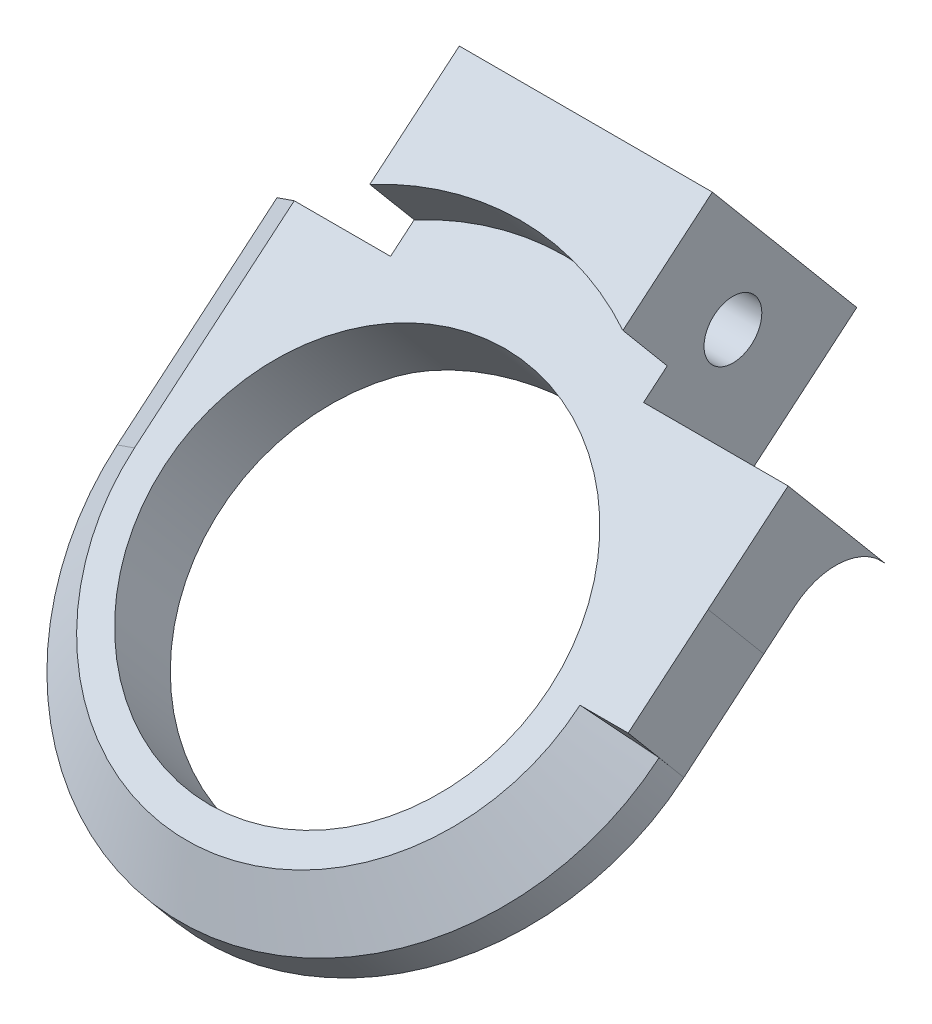
ISO-10303-21;
HEADER;
FILE_DESCRIPTION(('STEP AP214'),'2;1');
FILE_NAME('part.step','',(''),(''),'','','');
FILE_SCHEMA(('AUTOMOTIVE_DESIGN { 1 0 10303 214 1 1 1 1 }'));
ENDSEC;
DATA;
#1=APPLICATION_CONTEXT('core data for automotive mechanical design processes');
#2=APPLICATION_PROTOCOL_DEFINITION('international standard','automotive_design',2000,#1);
#3=PRODUCT_CONTEXT('',#1,'mechanical');
#4=PRODUCT('Part','Part','',(#3));
#5=PRODUCT_RELATED_PRODUCT_CATEGORY('part','',(#4));
#6=PRODUCT_DEFINITION_FORMATION('','',#4);
#7=PRODUCT_DEFINITION_CONTEXT('part definition',#1,'design');
#8=PRODUCT_DEFINITION('design','',#6,#7);
#9=PRODUCT_DEFINITION_SHAPE('','',#8);
#10=(LENGTH_UNIT() NAMED_UNIT(*) SI_UNIT(.MILLI.,.METRE.));
#11=(NAMED_UNIT(*) PLANE_ANGLE_UNIT() SI_UNIT($,.RADIAN.));
#12=(NAMED_UNIT(*) SI_UNIT($,.STERADIAN.) SOLID_ANGLE_UNIT());
#13=UNCERTAINTY_MEASURE_WITH_UNIT(LENGTH_MEASURE(1.E-05),#10,'distance_accuracy_value','');
#14=(GEOMETRIC_REPRESENTATION_CONTEXT(3) GLOBAL_UNCERTAINTY_ASSIGNED_CONTEXT((#13)) GLOBAL_UNIT_ASSIGNED_CONTEXT((#10,
#11,#12)) REPRESENTATION_CONTEXT('',''));
#15=CARTESIAN_POINT('',(0.,0.,0.));
#16=DIRECTION('',(0.,0.,1.));
#17=DIRECTION('',(1.,0.,0.));
#18=AXIS2_PLACEMENT_3D('',#15,#16,#17);
#19=CARTESIAN_POINT('',(-5.50115242270663,-19.2881865771624,11.9339053515406));
#20=DIRECTION('',(0.,-0.766044443118976,-0.642787609686541));
#21=DIRECTION('',(0.,0.642787609686541,-0.766044443118977));
#22=AXIS2_PLACEMENT_3D('',#19,#20,#21);
#23=CYLINDRICAL_SURFACE('',#22,8.43884757729339);
#24=DIRECTION('',(0.,-0.766044443118976,-0.642787609686541));
#25=VECTOR('',#24,1.);
#26=CARTESIAN_POINT('',(2.93769515458676,-19.2881865771624,11.9339053515406));
#27=LINE('',#26,#25);
#28=CARTESIAN_POINT('',(2.93769515458676,-20.4372532418409,10.9697239370108));
#29=VERTEX_POINT('',#28);
#30=CARTESIAN_POINT('',(2.93769515458676,-21.3565065735837,10.1983788053869));
#31=VERTEX_POINT('',#30);
#32=EDGE_CURVE('E339',#29,#31,#27,.T.);
#33=ORIENTED_EDGE('',*,*,#32,.F.);
#34=CARTESIAN_POINT('',(-5.50115242270663,-20.4372532418409,10.9697239370108));
#35=DIRECTION('',(0.,-0.766044443118977,-0.642787609686541));
#36=DIRECTION('',(0.,0.642787609686541,-0.766044443118976));
#37=AXIS2_PLACEMENT_3D('',#34,#35,#36);
#38=CIRCLE('',#37,8.43884757729339);
#39=CARTESIAN_POINT('',(-13.94,-20.4372532418409,10.9697239370108));
#40=VERTEX_POINT('',#39);
#41=EDGE_CURVE('E124',#29,#40,#38,.T.);
#42=ORIENTED_EDGE('',*,*,#41,.T.);
#43=DIRECTION('',(0.,-0.766044443118976,-0.642787609686541));
#44=VECTOR('',#43,1.);
#45=CARTESIAN_POINT('',(-13.94,-19.2881865771624,11.9339053515406));
#46=LINE('',#45,#44);
#47=CARTESIAN_POINT('',(-13.94,-21.3565065735837,10.1983788053869));
#48=VERTEX_POINT('',#47);
#49=EDGE_CURVE('E336',#40,#48,#46,.T.);
#50=ORIENTED_EDGE('',*,*,#49,.T.);
#51=CARTESIAN_POINT('',(-5.50115242270663,-21.3565065735837,10.1983788053869));
#52=DIRECTION('',(0.,-0.766044443118977,-0.642787609686541));
#53=DIRECTION('',(0.,0.642787609686541,-0.766044443118977));
#54=AXIS2_PLACEMENT_3D('',#51,#52,#53);
#55=CIRCLE('',#54,8.43884757729339);
#56=EDGE_CURVE('E327',#31,#48,#55,.T.);
#57=ORIENTED_EDGE('',*,*,#56,.F.);
#58=EDGE_LOOP('',(#33,#42,#50,#57));
#59=FACE_BOUND('',#58,.T.);
#60=ADVANCED_FACE('F113',(#59),#23,.T.);
#61=CARTESIAN_POINT('',(-13.9443048454133,-13.8457153207248,16.5006809755104));
#62=DIRECTION('',(0.,-0.642787609686541,0.766044443118976));
#63=DIRECTION('',(0.,-0.766044443118977,-0.642787609686541));
#64=AXIS2_PLACEMENT_3D('',#61,#62,#63);
#65=PLANE('',#64);
#66=DIRECTION('',(1.,0.,0.));
#67=VECTOR('',#66,1.);
#68=CARTESIAN_POINT('',(-13.9443048454133,-19.2881865771624,11.9339053515406));
#69=LINE('',#68,#67);
#70=CARTESIAN_POINT('',(1.43769515458674,-19.2881865771624,11.9339053515406));
#71=VERTEX_POINT('',#70);
#72=CARTESIAN_POINT('',(2.94,-19.2881865771624,11.9339053515406));
#73=VERTEX_POINT('',#72);
#74=EDGE_CURVE('E290',#71,#73,#69,.T.);
#75=ORIENTED_EDGE('',*,*,#74,.F.);
#76=DIRECTION('',(-0.707106781186548,0.5416752204197,0.454519477672045));
#77=VECTOR('',#76,1.);
#78=CARTESIAN_POINT('',(-5.50115242270663,-13.9727209489273,16.3941105997282));
#79=LINE('',#78,#77);
#80=EDGE_CURVE('E13',#71,#29,#79,.F.);
#81=ORIENTED_EDGE('',*,*,#80,.T.);
#82=ORIENTED_EDGE('',*,*,#32,.T.);
#83=DIRECTION('',(1.,0.,0.));
#84=VECTOR('',#83,1.);
#85=CARTESIAN_POINT('',(-13.9443048454133,-21.3565065735837,10.1983788053869));
#86=LINE('',#85,#84);
#87=CARTESIAN_POINT('',(2.94,-21.3565065735837,10.1983788053869));
#88=VERTEX_POINT('',#87);
#89=EDGE_CURVE('E296',#31,#88,#86,.T.);
#90=ORIENTED_EDGE('',*,*,#89,.T.);
#91=DIRECTION('',(0.,-0.766044443118977,-0.642787609686541));
#92=VECTOR('',#91,1.);
#93=CARTESIAN_POINT('',(2.94,-13.8457153207248,16.5006809755104));
#94=LINE('',#93,#92);
#95=EDGE_CURVE('E295',#73,#88,#94,.T.);
#96=ORIENTED_EDGE('',*,*,#95,.F.);
#97=EDGE_LOOP('',(#75,#81,#82,#90,#96));
#98=FACE_BOUND('',#97,.T.);
#99=ADVANCED_FACE('F397',(#98),#65,.T.);
#100=CARTESIAN_POINT('',(2.94,0.,0.));
#101=DIRECTION('',(1.,0.,0.));
#102=DIRECTION('',(0.,1.,0.));
#103=AXIS2_PLACEMENT_3D('',#100,#101,#102);
#104=PLANE('',#103);
#105=DIRECTION('',(0.,0.642787609686541,-0.766044443118976));
#106=VECTOR('',#105,1.);
#107=CARTESIAN_POINT('',(2.94,-7.51079125285886,-6.30230217012344));
#108=LINE('',#107,#106);
#109=CARTESIAN_POINT('',(2.94,-19.267446842078,7.70873436522123));
#110=VERTEX_POINT('',#109);
#111=EDGE_CURVE('E291',#88,#110,#108,.T.);
#112=ORIENTED_EDGE('',*,*,#111,.T.);
#113=DIRECTION('',(0.,0.766044443118874,0.642787609686663));
#114=VECTOR('',#113,1.);
#115=CARTESIAN_POINT('',(2.94,-11.7566555892223,14.0110365353439));
#116=LINE('',#115,#114);
#117=CARTESIAN_POINT('',(2.94,-17.1991268456568,9.44426091137489));
#118=VERTEX_POINT('',#117);
#119=EDGE_CURVE('E286',#110,#118,#116,.T.);
#120=ORIENTED_EDGE('',*,*,#119,.T.);
#121=DIRECTION('',(0.,-0.642787609686541,0.766044443118976));
#122=VECTOR('',#121,1.);
#123=CARTESIAN_POINT('',(2.94,-5.44247125643762,-4.56677562396978));
#124=LINE('',#123,#122);
#125=EDGE_CURVE('E300',#118,#73,#124,.T.);
#126=ORIENTED_EDGE('',*,*,#125,.T.);
#127=ORIENTED_EDGE('',*,*,#95,.T.);
#128=EDGE_LOOP('',(#112,#120,#126,#127));
#129=FACE_BOUND('',#128,.T.);
#130=ADVANCED_FACE('F400',(#129),#104,.T.);
#131=CARTESIAN_POINT('',(2.95296955309349,-5.44381737994169,-4.56517137644774));
#132=DIRECTION('',(-0.999999748529686,0.000455854061936737,-0.000543265716011508));
#133=DIRECTION('',(-0.000543265772457619,0.,0.999999852431139));
#134=AXIS2_PLACEMENT_3D('',#131,#132,#133);
#135=PLANE('',#134);
#136=DIRECTION('',(0.000709183025725883,0.642787448044539,-0.76604425048154));
#137=VECTOR('',#136,1.);
#138=CARTESIAN_POINT('',(2.95296955309349,-5.44381737994169,-4.56517137644774));
#139=LINE('',#138,#137);
#140=CARTESIAN_POINT('',(2.94230484541318,-15.1100671141999,6.95461647126721));
#141=VERTEX_POINT('',#140);
#142=EDGE_CURVE('E317',#118,#141,#139,.T.);
#143=ORIENTED_EDGE('',*,*,#142,.F.);
#144=ORIENTED_EDGE('',*,*,#119,.F.);
#145=DIRECTION('',(0.000709183025725883,0.642787448044539,-0.76604425048154));
#146=VECTOR('',#145,1.);
#147=CARTESIAN_POINT('',(2.95296955309348,-7.51213737636293,-6.3006979226014));
#148=LINE('',#147,#146);
#149=CARTESIAN_POINT('',(2.94088647900505,-18.4639623299942,6.7511788113515));
#150=VERTEX_POINT('',#149);
#151=EDGE_CURVE('E323',#110,#150,#148,.T.);
#152=ORIENTED_EDGE('',*,*,#151,.T.);
#153=CARTESIAN_POINT('',(2.94088647900505,-19.9960512162321,5.46560359197841));
#154=DIRECTION('',(-0.999999748529686,0.000455854061936737,-0.000543265716011508));
#155=DIRECTION('',(0.000709183025725883,0.642787448044569,-0.766044250481515));
#156=AXIS2_PLACEMENT_3D('',#153,#154,#155);
#157=ELLIPSE('',#156,2.00000050294075,2.);
#158=CARTESIAN_POINT('',(2.94230484541318,-18.7104742686853,3.93351615585046));
#159=VERTEX_POINT('',#158);
#160=EDGE_CURVE('E436',#150,#159,#157,.T.);
#161=ORIENTED_EDGE('',*,*,#160,.T.);
#162=DIRECTION('',(0.,-0.766044443118976,-0.642787609686541));
#163=VECTOR('',#162,1.);
#164=CARTESIAN_POINT('',(2.94230484541318,-15.1100671141999,6.95461647126721));
#165=LINE('',#164,#163);
#166=EDGE_CURVE('E319',#141,#159,#165,.T.);
#167=ORIENTED_EDGE('',*,*,#166,.F.);
#168=EDGE_LOOP('',(#143,#144,#152,#161,#167));
#169=FACE_BOUND('',#168,.T.);
#170=ADVANCED_FACE('F403',(#169),#135,.F.);
#171=CARTESIAN_POINT('',(-5.50115242270663,-19.2881865771624,11.9339053515406));
#172=DIRECTION('',(0.,-0.766044443118976,-0.642787609686541));
#173=DIRECTION('',(0.,0.642787609686541,-0.766044443118977));
#174=AXIS2_PLACEMENT_3D('',#171,#172,#173);
#175=CYLINDRICAL_SURFACE('',#174,6.);
#176=CARTESIAN_POINT('',(-5.50115242270663,-19.2881865771624,11.9339053515406));
#177=DIRECTION('',(0.,-0.766044443118977,-0.642787609686541));
#178=DIRECTION('',(0.,0.642787609686541,-0.766044443118977));
#179=AXIS2_PLACEMENT_3D('',#176,#177,#178);
#180=CIRCLE('',#179,6.);
#181=CARTESIAN_POINT('',(-5.50115242270663,-15.4314609190432,7.33763869282674));
#182=VERTEX_POINT('',#181);
#183=EDGE_CURVE('E309',#182,#182,#180,.T.);
#184=ORIENTED_EDGE('',*,*,#183,.F.);
#185=EDGE_LOOP('',(#184));
#186=FACE_BOUND('',#185,.T.);
#187=CARTESIAN_POINT('',(-5.50115242270663,-21.3565065735837,10.1983788053869));
#188=DIRECTION('',(0.,-0.766044443118977,-0.642787609686541));
#189=DIRECTION('',(0.,0.642787609686541,-0.766044443118977));
#190=AXIS2_PLACEMENT_3D('',#187,#188,#189);
#191=CIRCLE('',#190,6.);
#192=CARTESIAN_POINT('',(-1.53252545610982,-18.4639623299942,6.75117881135149));
#193=VERTEX_POINT('',#192);
#194=CARTESIAN_POINT('',(-9.46977938930343,-18.4639623299942,6.75117881135149));
#195=VERTEX_POINT('',#194);
#196=EDGE_CURVE('E304',#193,#195,#191,.T.);
#197=ORIENTED_EDGE('',*,*,#196,.T.);
#198=CARTESIAN_POINT('',(-9.46977938930343,-18.4639623299942,6.75117881135149));
#199=CARTESIAN_POINT('',(-9.37862169468854,-18.4122980321714,6.68955321661601));
#200=CARTESIAN_POINT('',(-9.28509953104678,-18.3661466106757,6.62706909844798));
#201=CARTESIAN_POINT('',(-9.09416672156057,-18.283826019583,6.50190247073366));
#202=CARTESIAN_POINT('',(-8.99676425993292,-18.2476369938758,6.43922061139788));
#203=CARTESIAN_POINT('',(-8.79876985312388,-18.1840730814926,6.31506263327178));
#204=CARTESIAN_POINT('',(-8.69818582699753,-18.1566779522092,6.25358405574983));
#205=CARTESIAN_POINT('',(-8.49397943520097,-18.1094655647828,6.13269363169669));
#206=CARTESIAN_POINT('',(-8.39035522162075,-18.0896530227762,6.07328309223355));
#207=CARTESIAN_POINT('',(-8.13368430218231,-18.0491805338425,5.93171886702356));
#208=CARTESIAN_POINT('',(-7.97916556496682,-18.0320671812606,5.85120981137211));
#209=CARTESIAN_POINT('',(-7.66495794070854,-18.0082430426636,5.69914060067199));
#210=CARTESIAN_POINT('',(-7.5052665709667,-18.0015373298356,5.62758482549946));
#211=CARTESIAN_POINT('',(-7.18108293056653,-17.9952123977869,5.49638329640465));
#212=CARTESIAN_POINT('',(-7.01659534371404,-17.9955864817933,5.43672634138484));
#213=CARTESIAN_POINT('',(-6.68291332584876,-17.9997874233723,5.33273705149118));
#214=CARTESIAN_POINT('',(-6.51372272179532,-18.003611548921,5.28839262932088));
#215=CARTESIAN_POINT('',(-6.2229202094354,-18.0099041275027,5.22934522650318));
#216=CARTESIAN_POINT('',(-6.10230761649468,-18.0124343136945,5.20973827466109));
#217=CARTESIAN_POINT('',(-5.85982011443931,-18.0163410706682,5.18106285275405));
#218=CARTESIAN_POINT('',(-5.73794559862681,-18.0177179905451,5.17199119332329));
#219=CARTESIAN_POINT('',(-5.4941712724623,-18.0187631380412,5.16502739148684));
#220=CARTESIAN_POINT('',(-5.37227230410129,-18.0184356742397,5.16710705959902));
#221=CARTESIAN_POINT('',(-5.12916532922561,-18.0162153236688,5.18222544631032));
#222=CARTESIAN_POINT('',(-5.00795747769241,-18.0143220986858,5.19526653265087));
#223=CARTESIAN_POINT('',(-4.73628787660028,-18.0091328277104,5.23608180582959));
#224=CARTESIAN_POINT('',(-4.58627139066659,-18.005601855995,5.26677073907089));
#225=CARTESIAN_POINT('',(-4.28958537431741,-17.999552060821,5.34157190222072));
#226=CARTESIAN_POINT('',(-4.14291811550882,-17.9970339061351,5.38569296782694));
#227=CARTESIAN_POINT('',(-3.85218606796885,-17.9955237993675,5.48516429859632));
#228=CARTESIAN_POINT('',(-3.70815027659727,-17.9965593405046,5.54059898115322));
#229=CARTESIAN_POINT('',(-3.42397785310256,-18.0046393537908,5.66021412265168));
#230=CARTESIAN_POINT('',(-3.28384041740168,-18.0116825779404,5.7243927628503));
#231=CARTESIAN_POINT('',(-3.00118372744777,-18.0345576296606,5.86269670713215));
#232=CARTESIAN_POINT('',(-2.85885255966114,-18.0507796951208,5.93714418487629));
#233=CARTESIAN_POINT('',(-2.57889169389656,-18.0948075401798,6.09147852925638));
#234=CARTESIAN_POINT('',(-2.44126382668022,-18.1226177761389,6.17136747857317));
#235=CARTESIAN_POINT('',(-2.17294570267754,-18.1920256799879,6.33346492858196));
#236=CARTESIAN_POINT('',(-2.04219720263159,-18.2334734729486,6.41563969714904));
#237=CARTESIAN_POINT('',(-1.78742207734757,-18.3327328685745,6.58032799906759));
#238=CARTESIAN_POINT('',(-1.66338739552647,-18.3905243158119,6.66284099255785));
#239=CARTESIAN_POINT('',(-1.43023029967731,-18.5213118071472,6.82022741030451));
#240=CARTESIAN_POINT('',(-1.32066219014979,-18.5932836423387,6.89527050451693));
#241=CARTESIAN_POINT('',(-1.16284429055658,-18.7155390999362,7.0029000143598));
#242=CARTESIAN_POINT('',(-1.11105055831094,-18.7589637747549,7.03814090923168));
#243=CARTESIAN_POINT('',(-1.01010230325754,-18.8507106188197,7.1061701702599));
#244=CARTESIAN_POINT('',(-0.96095177029142,-18.8990398906119,7.13895485661951));
#245=CARTESIAN_POINT('',(-0.913300712983845,-18.9498484746997,7.1701445341708));
#246=B_SPLINE_CURVE_WITH_KNOTS('',3,(#198,#199,#200,#201,#202,#203,#204,#205,#206,#207,#208,
#209,#210,#211,#212,#213,#214,#215,#216,#217,#218,#219,#220,#221,#222,#223,#224,#225,#226,#227,
#228,#229,#230,#231,#232,#233,#234,#235,#236,#237,#238,#239,#240,#241,#242,#243,#244,#245),
.UNSPECIFIED.,.F.,.F.,(4,2,2,2,2,2,2,2,2,2,2,2,2,2,2,2,2,2,2,2,2,2,2,4),(0.,0.364334039627484,
0.727936577060484,1.09069603649164,1.45368075591004,1.97820039848978,2.50297563711395,
3.02725451618555,3.55111859262062,3.91738007298245,4.28353064549791,4.64875606168347,
5.01406038934136,5.47277988801226,5.9318017881586,6.39438289789354,6.85686793724611,
7.34067646906679,7.82467122681737,8.30351532887487,8.78177146368479,9.2334325964669,
9.46188901720993,9.6906811283447),.UNSPECIFIED.);
#247=EDGE_CURVE('E518',#195,#193,#246,.T.);
#248=ORIENTED_EDGE('',*,*,#247,.T.);
#249=EDGE_LOOP('',(#197,#248));
#250=FACE_BOUND('',#249,.T.);
#251=ADVANCED_FACE('F386',(#186,#250),#175,.F.);
#252=CARTESIAN_POINT('',(6.34145450061764,-9.15778680556446,-7.68429553094933));
#253=DIRECTION('',(0.,-0.766044443118977,-0.642787609686541));
#254=DIRECTION('',(0.,0.642787609686541,-0.766044443118977));
#255=AXIS2_PLACEMENT_3D('',#252,#253,#254);
#256=PLANE('',#255);
#257=DIRECTION('',(0.,-0.642787609686541,0.766044443118977));
#258=VECTOR('',#257,1.);
#259=CARTESIAN_POINT('',(-9.44230484541406,-9.15778680556462,-7.68429553094947));
#260=LINE('',#259,#258);
#261=CARTESIAN_POINT('',(-9.44230484541406,-15.8685596587687,0.313292125940205));
#262=VERTEX_POINT('',#261);
#263=CARTESIAN_POINT('',(-9.44230484541406,-18.8253826633269,3.8370965642875));
#264=VERTEX_POINT('',#263);
#265=EDGE_CURVE('E473',#262,#264,#260,.T.);
#266=ORIENTED_EDGE('',*,*,#265,.F.);
#267=DIRECTION('',(-1.,0.,0.));
#268=VECTOR('',#267,1.);
#269=CARTESIAN_POINT('',(6.34145450061764,-15.8685596587686,0.313292125940343));
#270=LINE('',#269,#268);
#271=CARTESIAN_POINT('',(-1.55999999999991,-15.8685596587686,0.313292125940294));
#272=VERTEX_POINT('',#271);
#273=EDGE_CURVE('E254',#272,#262,#270,.T.);
#274=ORIENTED_EDGE('',*,*,#273,.F.);
#275=DIRECTION('',(0.,0.642787609686541,-0.766044443118977));
#276=VECTOR('',#275,1.);
#277=CARTESIAN_POINT('',(-1.55999999999991,-9.15778680556454,-7.6842955309494));
#278=LINE('',#277,#276);
#279=CARTESIAN_POINT('',(-1.5599999999999,-18.8253826633268,3.83709656428759));
#280=VERTEX_POINT('',#279);
#281=EDGE_CURVE('E256',#280,#272,#278,.T.);
#282=ORIENTED_EDGE('',*,*,#281,.F.);
#283=DIRECTION('',(1.,0.,0.));
#284=VECTOR('',#283,1.);
#285=CARTESIAN_POINT('',(2.51804077670073,-18.8253826633267,3.83709656428762));
#286=LINE('',#285,#284);
#287=EDGE_CURVE('E268',#264,#280,#286,.T.);
#288=ORIENTED_EDGE('',*,*,#287,.F.);
#289=EDGE_LOOP('',(#266,#274,#282,#288));
#290=FACE_BOUND('',#289,.T.);
#291=ADVANCED_FACE('F380',(#290),#256,.T.);
#292=CARTESIAN_POINT('',(6.34145450061755,-3.79547570373163,-3.18478226314355));
#293=DIRECTION('',(0.,0.766044443118977,0.642787609686541));
#294=DIRECTION('',(0.,-0.642787609686541,0.766044443118977));
#295=AXIS2_PLACEMENT_3D('',#292,#293,#294);
#296=PLANE('',#295);
#297=DIRECTION('',(0.,0.642787609686541,-0.766044443118977));
#298=VECTOR('',#297,1.);
#299=CARTESIAN_POINT('',(-9.44230484541415,-3.79547570373179,-3.18478226314369));
#300=LINE('',#299,#298);
#301=CARTESIAN_POINT('',(-9.44230484541415,-12.8447089328262,7.59967394785243));
#302=VERTEX_POINT('',#301);
#303=CARTESIAN_POINT('',(-9.44230484541415,-10.5062485569359,4.81280539374598));
#304=VERTEX_POINT('',#303);
#305=EDGE_CURVE('E231',#302,#304,#300,.T.);
#306=ORIENTED_EDGE('',*,*,#305,.F.);
#307=CARTESIAN_POINT('',(-5.50115242270663,-17.6411910244565,13.3158987123667));
#308=DIRECTION('',(0.,0.766044443118977,0.642787609686541));
#309=DIRECTION('',(0.,-0.642787609686541,0.766044443118977));
#310=AXIS2_PLACEMENT_3D('',#307,#308,#309);
#311=CIRCLE('',#310,8.43884757729339);
#312=CARTESIAN_POINT('',(-1.56,-12.8447089328258,7.59967394785214));
#313=VERTEX_POINT('',#312);
#314=EDGE_CURVE('E263',#313,#302,#311,.T.);
#315=ORIENTED_EDGE('',*,*,#314,.F.);
#316=DIRECTION('',(0.,-0.64278760968654,0.766044443118977));
#317=VECTOR('',#316,1.);
#318=CARTESIAN_POINT('',(-1.56,-10.5062485569358,4.81280539374605));
#319=LINE('',#318,#317);
#320=CARTESIAN_POINT('',(-1.56,-10.5062485569358,4.81280539374605));
#321=VERTEX_POINT('',#320);
#322=EDGE_CURVE('E261',#321,#313,#319,.T.);
#323=ORIENTED_EDGE('',*,*,#322,.F.);
#324=DIRECTION('',(-1.,0.,0.));
#325=VECTOR('',#324,1.);
#326=CARTESIAN_POINT('',(6.34145450061755,-10.5062485569357,4.81280539374612));
#327=LINE('',#326,#325);
#328=EDGE_CURVE('E252',#321,#304,#327,.T.);
#329=ORIENTED_EDGE('',*,*,#328,.T.);
#330=EDGE_LOOP('',(#306,#315,#323,#329));
#331=FACE_BOUND('',#330,.T.);
#332=ADVANCED_FACE('F260',(#331),#296,.T.);
#333=CARTESIAN_POINT('',(6.34145450061748,-6.71077285320405,7.99758765688973));
#334=DIRECTION('',(0.,0.642787609686541,-0.766044443118977));
#335=DIRECTION('',(0.,0.766044443118977,0.642787609686541));
#336=AXIS2_PLACEMENT_3D('',#333,#334,#335);
#337=PLANE('',#336);
#338=DIRECTION('',(0.,0.766044443118977,0.642787609686541));
#339=VECTOR('',#338,1.);
#340=CARTESIAN_POINT('',(-9.44230484541395,-22.2721798674512,-5.0599832293646));
#341=LINE('',#340,#339);
#342=EDGE_CURVE('E235',#262,#304,#341,.T.);
#343=ORIENTED_EDGE('',*,*,#342,.T.);
#344=ORIENTED_EDGE('',*,*,#328,.F.);
#345=DIRECTION('',(0.,0.766044443118977,0.642787609686541));
#346=VECTOR('',#345,1.);
#347=CARTESIAN_POINT('',(-1.55999999999979,-22.2721798674511,-5.05998322936453));
#348=LINE('',#347,#346);
#349=EDGE_CURVE('E491',#272,#321,#348,.T.);
#350=ORIENTED_EDGE('',*,*,#349,.F.);
#351=ORIENTED_EDGE('',*,*,#273,.T.);
#352=EDGE_LOOP('',(#343,#344,#350,#351));
#353=FACE_BOUND('',#352,.T.);
#354=ADVANCED_FACE('F250',(#353),#337,.T.);
#355=CARTESIAN_POINT('',(0.,-5.44247125643763,-4.56677562396978));
#356=DIRECTION('',(0.,-0.766044443118977,-0.642787609686541));
#357=DIRECTION('',(0.,0.642787609686541,-0.766044443118977));
#358=AXIS2_PLACEMENT_3D('',#355,#356,#357);
#359=PLANE('',#358);
#360=ORIENTED_EDGE('',*,*,#183,.T.);
#361=EDGE_LOOP('',(#360));
#362=FACE_BOUND('',#361,.T.);
#363=DIRECTION('',(1.,0.,0.));
#364=VECTOR('',#363,1.);
#365=CARTESIAN_POINT('',(0.,-15.1100671141999,6.95461647126719));
#366=LINE('',#365,#364);
#367=CARTESIAN_POINT('',(-12.4423047511118,-15.1100671141999,6.9546164712672));
#368=VERTEX_POINT('',#367);
#369=CARTESIAN_POINT('',(-9.44230484541412,-15.1100671141999,6.9546164712672));
#370=VERTEX_POINT('',#369);
#371=EDGE_CURVE('E283',#368,#370,#366,.T.);
#372=ORIENTED_EDGE('',*,*,#371,.F.);
#373=DIRECTION('',(0.000354591579746087,-0.642787569276029,0.766044394959604));
#374=VECTOR('',#373,1.);
#375=CARTESIAN_POINT('',(-12.4400000943014,-19.2878446865515,11.9334979021767));
#376=LINE('',#375,#374);
#377=CARTESIAN_POINT('',(-12.4399999796145,-19.2878446865571,11.9334979021835));
#378=VERTEX_POINT('',#377);
#379=EDGE_CURVE('E137',#368,#378,#376,.T.);
#380=ORIENTED_EDGE('',*,*,#379,.T.);
#381=CARTESIAN_POINT('',(-5.50115242270663,-19.2881865771624,11.9339053515406));
#382=DIRECTION('',(0.,-0.766044443118977,-0.642787609686541));
#383=DIRECTION('',(0.,0.642787609686541,-0.766044443118977));
#384=AXIS2_PLACEMENT_3D('',#381,#382,#383);
#385=CIRCLE('',#384,6.93884757729337);
#386=EDGE_CURVE('E448',#378,#71,#385,.F.);
#387=ORIENTED_EDGE('',*,*,#386,.T.);
#388=ORIENTED_EDGE('',*,*,#74,.T.);
#389=ORIENTED_EDGE('',*,*,#125,.F.);
#390=ORIENTED_EDGE('',*,*,#142,.T.);
#391=DIRECTION('',(-1.,0.,0.));
#392=VECTOR('',#391,1.);
#393=CARTESIAN_POINT('',(0.,-15.1100671141999,6.95461647126721));
#394=LINE('',#393,#392);
#395=CARTESIAN_POINT('',(-1.55999999999997,-15.1100671141999,6.95461647126721));
#396=VERTEX_POINT('',#395);
#397=EDGE_CURVE('E313',#141,#396,#394,.T.);
#398=ORIENTED_EDGE('',*,*,#397,.T.);
#399=DIRECTION('',(0.,0.642787609686541,-0.766044443118977));
#400=VECTOR('',#399,1.);
#401=CARTESIAN_POINT('',(-1.55999999999997,-5.44247125643763,-4.56677562396978));
#402=LINE('',#401,#400);
#403=CARTESIAN_POINT('',(-1.55999999999997,-14.4917044855318,6.21768058702598));
#404=VERTEX_POINT('',#403);
#405=EDGE_CURVE('E486',#396,#404,#402,.T.);
#406=ORIENTED_EDGE('',*,*,#405,.T.);
#407=CARTESIAN_POINT('',(-5.50115242270663,-19.2881865771624,11.9339053515406));
#408=DIRECTION('',(0.,0.766044443118977,0.642787609686541));
#409=DIRECTION('',(0.,-0.642787609686541,0.766044443118977));
#410=AXIS2_PLACEMENT_3D('',#407,#408,#409);
#411=CIRCLE('',#410,8.43884757729339);
#412=CARTESIAN_POINT('',(-9.44230484541412,-14.491704485532,6.21768058702632));
#413=VERTEX_POINT('',#412);
#414=EDGE_CURVE('E279',#404,#413,#411,.T.);
#415=ORIENTED_EDGE('',*,*,#414,.T.);
#416=DIRECTION('',(0.,-0.642787609686541,0.766044443118977));
#417=VECTOR('',#416,1.);
#418=CARTESIAN_POINT('',(-9.44230484541412,-5.44247125643763,-4.56677562396978));
#419=LINE('',#418,#417);
#420=EDGE_CURVE('E469',#413,#370,#419,.T.);
#421=ORIENTED_EDGE('',*,*,#420,.T.);
#422=EDGE_LOOP('',(#372,#380,#387,#388,#389,#390,#398,#406,#415,#421));
#423=FACE_BOUND('',#422,.T.);
#424=ADVANCED_FACE('F383',(#362,#423),#359,.F.);
#425=CARTESIAN_POINT('',(0.,-7.51079125285887,-6.30230217012345));
#426=DIRECTION('',(0.,-0.766044443118977,-0.642787609686541));
#427=DIRECTION('',(0.,0.642787609686541,-0.766044443118977));
#428=AXIS2_PLACEMENT_3D('',#425,#426,#427);
#429=PLANE('',#428);
#430=DIRECTION('',(-0.000354591579746087,0.642787569276029,-0.766044394959604));
#431=VECTOR('',#430,1.);
#432=CARTESIAN_POINT('',(-13.9476361881291,-7.51397029696374,-6.29851353289044));
#433=LINE('',#432,#431);
#434=CARTESIAN_POINT('',(-13.9415956622092,-18.4639623299942,6.75117881135149));
#435=VERTEX_POINT('',#434);
#436=EDGE_CURVE('E314',#48,#435,#433,.T.);
#437=ORIENTED_EDGE('',*,*,#436,.T.);
#438=DIRECTION('',(-1.,0.,0.));
#439=VECTOR('',#438,1.);
#440=CARTESIAN_POINT('',(2.51804077670124,-18.4639623299942,6.75117881135149));
#441=LINE('',#440,#439);
#442=EDGE_CURVE('E350',#435,#195,#441,.F.);
#443=ORIENTED_EDGE('',*,*,#442,.T.);
#444=ORIENTED_EDGE('',*,*,#196,.F.);
#445=DIRECTION('',(-1.,0.,0.));
#446=VECTOR('',#445,1.);
#447=CARTESIAN_POINT('',(2.51804077670124,-18.4639623299942,6.75117881135149));
#448=LINE('',#447,#446);
#449=EDGE_CURVE('E347',#193,#150,#448,.F.);
#450=ORIENTED_EDGE('',*,*,#449,.T.);
#451=ORIENTED_EDGE('',*,*,#151,.F.);
#452=ORIENTED_EDGE('',*,*,#111,.F.);
#453=ORIENTED_EDGE('',*,*,#89,.F.);
#454=ORIENTED_EDGE('',*,*,#56,.T.);
#455=EDGE_LOOP('',(#437,#443,#444,#450,#451,#452,#453,#454));
#456=FACE_BOUND('',#455,.T.);
#457=ADVANCED_FACE('F407',(#456),#429,.T.);
#458=CARTESIAN_POINT('',(-13.9476361881291,-5.44565030054251,-4.56298698673678));
#459=DIRECTION('',(-0.999999937132404,-0.000227927073959834,0.000271632909241377));
#460=DIRECTION('',(0.000271632916297144,0.,0.999999963107779));
#461=AXIS2_PLACEMENT_3D('',#458,#459,#460);
#462=PLANE('',#461);
#463=ORIENTED_EDGE('',*,*,#49,.F.);
#464=DIRECTION('',(-0.000354591579746087,0.642787569276029,-0.766044394959604));
#465=VECTOR('',#464,1.);
#466=CARTESIAN_POINT('',(-13.9423048454133,-16.2591337788783,5.99043505673738));
#467=LINE('',#466,#465);
#468=CARTESIAN_POINT('',(-13.9423048454133,-16.2591337788784,5.9904350567374));
#469=VERTEX_POINT('',#468);
#470=EDGE_CURVE('E435',#40,#469,#467,.T.);
#471=ORIENTED_EDGE('',*,*,#470,.T.);
#472=DIRECTION('',(0.,-0.766044443118976,-0.642787609686541));
#473=VECTOR('',#472,1.);
#474=CARTESIAN_POINT('',(-13.9423048454133,-15.1100671141999,6.95461647126722));
#475=LINE('',#474,#473);
#476=CARTESIAN_POINT('',(-13.9423048454133,-18.710474838335,3.93351567785764));
#477=VERTEX_POINT('',#476);
#478=EDGE_CURVE('E245',#469,#477,#475,.T.);
#479=ORIENTED_EDGE('',*,*,#478,.T.);
#480=CARTESIAN_POINT('',(-13.9415956622092,-19.9960512162321,5.46560359197841));
#481=DIRECTION('',(-0.999999937132404,-0.000227927073959834,0.000271632909241377));
#482=DIRECTION('',(0.000354591579746087,-0.642787569275969,0.766044394959654));
#483=AXIS2_PLACEMENT_3D('',#480,#481,#482);
#484=ELLIPSE('',#483,2.0000001257352,2.);
#485=EDGE_CURVE('E359',#477,#435,#484,.F.);
#486=ORIENTED_EDGE('',*,*,#485,.T.);
#487=ORIENTED_EDGE('',*,*,#436,.F.);
#488=EDGE_LOOP('',(#463,#471,#479,#486,#487));
#489=FACE_BOUND('',#488,.T.);
#490=ADVANCED_FACE('F411',(#489),#462,.T.);
#491=CARTESIAN_POINT('',(0.,-15.1100671141999,6.95461647126721));
#492=DIRECTION('',(0.,-0.642787609686541,0.766044443118976));
#493=DIRECTION('',(0.,-0.766044443118977,-0.642787609686541));
#494=AXIS2_PLACEMENT_3D('',#491,#492,#493);
#495=PLANE('',#494);
#496=ORIENTED_EDGE('',*,*,#166,.T.);
#497=CARTESIAN_POINT('',(2.94230484541318,-18.7104748401662,3.93351567632097));
#498=CARTESIAN_POINT('',(-1.55999999999991,-18.7104759968591,3.93351470574047));
#499=B_SPLINE_CURVE_WITH_KNOTS('',1,(#497,#498),.UNSPECIFIED.,.F.,.F.,(2,2),(0.,1.),.UNSPECIFIED.);
#500=CARTESIAN_POINT('',(-1.55999999999991,-18.7104759968591,3.93351470574046));
#501=VERTEX_POINT('',#500);
#502=EDGE_CURVE('E429',#159,#501,#499,.T.);
#503=ORIENTED_EDGE('',*,*,#502,.T.);
#504=DIRECTION('',(0.,0.766044443118977,0.642787609686541));
#505=VECTOR('',#504,1.);
#506=CARTESIAN_POINT('',(-1.55999999999979,-25.2290028720092,-1.53617879101721));
#507=LINE('',#506,#505);
#508=EDGE_CURVE('E493',#501,#396,#507,.T.);
#509=ORIENTED_EDGE('',*,*,#508,.T.);
#510=ORIENTED_EDGE('',*,*,#397,.F.);
#511=EDGE_LOOP('',(#496,#503,#509,#510));
#512=FACE_BOUND('',#511,.T.);
#513=ADVANCED_FACE('F395',(#512),#495,.F.);
#514=CARTESIAN_POINT('',(-5.50115242270663,-12.7002043663392,17.4618787948449));
#515=DIRECTION('',(0.,-0.766044443118976,-0.642787609686541));
#516=DIRECTION('',(0.,0.642787609686541,-0.766044443118977));
#517=AXIS2_PLACEMENT_3D('',#514,#515,#516);
#518=CYLINDRICAL_SURFACE('',#517,8.43884757729339);
#519=DIRECTION('',(0.,-0.766044443118976,-0.642787609686541));
#520=VECTOR('',#519,1.);
#521=CARTESIAN_POINT('',(-9.44230484541424,-7.90372227470892,11.7456540303306));
#522=LINE('',#521,#520);
#523=EDGE_CURVE('E238',#413,#302,#522,.F.);
#524=ORIENTED_EDGE('',*,*,#523,.F.);
#525=ORIENTED_EDGE('',*,*,#414,.F.);
#526=DIRECTION('',(0.,-0.766044443118976,-0.642787609686541));
#527=VECTOR('',#526,1.);
#528=CARTESIAN_POINT('',(-1.56000000000009,-7.90372227470847,11.7456540303302));
#529=LINE('',#528,#527);
#530=EDGE_CURVE('E483',#313,#404,#529,.T.);
#531=ORIENTED_EDGE('',*,*,#530,.F.);
#532=ORIENTED_EDGE('',*,*,#314,.T.);
#533=EDGE_LOOP('',(#524,#525,#531,#532));
#534=FACE_BOUND('',#533,.T.);
#535=ADVANCED_FACE('F392',(#534),#518,.F.);
#536=CARTESIAN_POINT('',(2.51804077670124,-47.3490866946914,-20.0971329682405));
#537=DIRECTION('',(0.,-0.642787609686541,0.766044443118977));
#538=DIRECTION('',(0.,-0.766044443118977,-0.642787609686541));
#539=AXIS2_PLACEMENT_3D('',#536,#537,#538);
#540=PLANE('',#539);
#541=EDGE_CURVE('E497',#280,#501,#507,.T.);
#542=ORIENTED_EDGE('',*,*,#541,.T.);
#543=DIRECTION('',(-1.,0.,0.));
#544=VECTOR('',#543,1.);
#545=CARTESIAN_POINT('',(2.51804077670124,-18.710475996859,3.93351470574045));
#546=LINE('',#545,#544);
#547=CARTESIAN_POINT('',(-9.44230484541406,-18.7104759968591,3.93351470574046));
#548=VERTEX_POINT('',#547);
#549=EDGE_CURVE('E244',#501,#548,#546,.T.);
#550=ORIENTED_EDGE('',*,*,#549,.T.);
#551=DIRECTION('',(0.,0.766044443118977,0.642787609686541));
#552=VECTOR('',#551,1.);
#553=CARTESIAN_POINT('',(-9.44230484541395,-25.2290028720093,-1.53617879101728));
#554=LINE('',#553,#552);
#555=EDGE_CURVE('E257',#264,#548,#554,.T.);
#556=ORIENTED_EDGE('',*,*,#555,.F.);
#557=ORIENTED_EDGE('',*,*,#287,.T.);
#558=EDGE_LOOP('',(#542,#550,#556,#557));
#559=FACE_BOUND('',#558,.T.);
#560=ADVANCED_FACE('F376',(#559),#540,.T.);
#561=CARTESIAN_POINT('',(-1.55999999999979,-22.2721798674511,-5.05998322936453));
#562=DIRECTION('',(-1.,0.,0.));
#563=DIRECTION('',(0.,-1.,0.));
#564=AXIS2_PLACEMENT_3D('',#561,#562,#563);
#565=PLANE('',#564);
#566=ORIENTED_EDGE('',*,*,#530,.T.);
#567=ORIENTED_EDGE('',*,*,#405,.F.);
#568=ORIENTED_EDGE('',*,*,#508,.F.);
#569=ORIENTED_EDGE('',*,*,#541,.F.);
#570=ORIENTED_EDGE('',*,*,#281,.T.);
#571=ORIENTED_EDGE('',*,*,#349,.T.);
#572=ORIENTED_EDGE('',*,*,#322,.T.);
#573=EDGE_LOOP('',(#566,#567,#568,#569,#570,#571,#572));
#574=FACE_BOUND('',#573,.T.);
#575=CARTESIAN_POINT('',(-1.55999999999995,-14.537258088194,4.17174209039302));
#576=DIRECTION('',(-1.,0.,0.));
#577=DIRECTION('',(0.,-1.,0.));
#578=AXIS2_PLACEMENT_3D('',#575,#576,#577);
#579=CIRCLE('',#578,0.899999999999999);
#580=CARTESIAN_POINT('',(-1.55999999999994,-15.437258088194,4.17174209039302));
#581=VERTEX_POINT('',#580);
#582=EDGE_CURVE('E478',#581,#581,#579,.F.);
#583=ORIENTED_EDGE('',*,*,#582,.F.);
#584=EDGE_LOOP('',(#583));
#585=FACE_BOUND('',#584,.T.);
#586=ADVANCED_FACE('F373',(#574,#585),#565,.F.);
#587=CARTESIAN_POINT('',(-9.44230484541395,-22.2721798674512,-5.0599832293646));
#588=DIRECTION('',(1.,0.,0.));
#589=DIRECTION('',(0.,1.,0.));
#590=AXIS2_PLACEMENT_3D('',#587,#588,#589);
#591=PLANE('',#590);
#592=ORIENTED_EDGE('',*,*,#523,.T.);
#593=ORIENTED_EDGE('',*,*,#305,.T.);
#594=ORIENTED_EDGE('',*,*,#342,.F.);
#595=ORIENTED_EDGE('',*,*,#265,.T.);
#596=ORIENTED_EDGE('',*,*,#555,.T.);
#597=EDGE_CURVE('E500',#548,#370,#554,.T.);
#598=ORIENTED_EDGE('',*,*,#597,.T.);
#599=ORIENTED_EDGE('',*,*,#420,.F.);
#600=EDGE_LOOP('',(#592,#593,#594,#595,#596,#598,#599));
#601=FACE_BOUND('',#600,.T.);
#602=CARTESIAN_POINT('',(-9.4423048454141,-14.5372580881941,4.17174209039296));
#603=DIRECTION('',(1.,0.,0.));
#604=DIRECTION('',(0.,1.,0.));
#605=AXIS2_PLACEMENT_3D('',#602,#603,#604);
#606=CIRCLE('',#605,0.899999999999999);
#607=CARTESIAN_POINT('',(-9.44230484541411,-13.6372580881941,4.17174209039296));
#608=VERTEX_POINT('',#607);
#609=EDGE_CURVE('E271',#608,#608,#606,.F.);
#610=ORIENTED_EDGE('',*,*,#609,.F.);
#611=EDGE_LOOP('',(#610));
#612=FACE_BOUND('',#611,.T.);
#613=ADVANCED_FACE('F233',(#601,#612),#591,.F.);
#614=CARTESIAN_POINT('',(-13.9423048454139,-25.2290028720093,-1.53617879101732));
#615=DIRECTION('',(0.,-0.642787609686541,0.766044443118977));
#616=DIRECTION('',(0.,-0.766044443118977,-0.642787609686541));
#617=AXIS2_PLACEMENT_3D('',#614,#615,#616);
#618=PLANE('',#617);
#619=ORIENTED_EDGE('',*,*,#478,.F.);
#620=DIRECTION('',(0.707106803413601,0.541675203392789,0.454519463384769));
#621=VECTOR('',#620,1.);
#622=CARTESIAN_POINT('',(-13.9449705169388,-16.2611758016092,5.98872159621703));
#623=LINE('',#622,#621);
#624=EDGE_CURVE('E445',#469,#368,#623,.T.);
#625=ORIENTED_EDGE('',*,*,#624,.T.);
#626=ORIENTED_EDGE('',*,*,#371,.T.);
#627=ORIENTED_EDGE('',*,*,#597,.F.);
#628=CARTESIAN_POINT('',(-13.9423048454133,-18.7104748383349,3.93351567785762));
#629=CARTESIAN_POINT('',(-9.44230484541406,-18.710475996859,3.93351470574047));
#630=B_SPLINE_CURVE_WITH_KNOTS('',1,(#628,#629),.UNSPECIFIED.,.F.,.F.,(2,2),(0.,1.),.UNSPECIFIED.);
#631=EDGE_CURVE('E353',#548,#477,#630,.F.);
#632=ORIENTED_EDGE('',*,*,#631,.T.);
#633=EDGE_LOOP('',(#619,#625,#626,#627,#632));
#634=FACE_BOUND('',#633,.T.);
#635=ADVANCED_FACE('F361',(#634),#618,.F.);
#636=CARTESIAN_POINT('',(6.3414545006176,-14.537258088194,4.17174209039309));
#637=DIRECTION('',(-1.,0.,0.));
#638=DIRECTION('',(0.,-1.,0.));
#639=AXIS2_PLACEMENT_3D('',#636,#637,#638);
#640=CYLINDRICAL_SURFACE('',#639,0.899999999999999);
#641=ORIENTED_EDGE('',*,*,#609,.T.);
#642=EDGE_LOOP('',(#641));
#643=FACE_BOUND('',#642,.T.);
#644=ORIENTED_EDGE('',*,*,#582,.T.);
#645=EDGE_LOOP('',(#644));
#646=FACE_BOUND('',#645,.T.);
#647=ADVANCED_FACE('F371',(#643,#646),#640,.F.);
#648=CARTESIAN_POINT('',(2.51804077670124,-19.9960512162321,5.46560359197841));
#649=DIRECTION('',(1.,0.,0.));
#650=DIRECTION('',(0.,1.,0.));
#651=AXIS2_PLACEMENT_3D('',#648,#649,#650);
#652=CYLINDRICAL_SURFACE('',#651,2.);
#653=ORIENTED_EDGE('',*,*,#442,.F.);
#654=ORIENTED_EDGE('',*,*,#485,.F.);
#655=ORIENTED_EDGE('',*,*,#631,.F.);
#656=ORIENTED_EDGE('',*,*,#549,.F.);
#657=ORIENTED_EDGE('',*,*,#502,.F.);
#658=ORIENTED_EDGE('',*,*,#160,.F.);
#659=ORIENTED_EDGE('',*,*,#449,.F.);
#660=ORIENTED_EDGE('',*,*,#247,.F.);
#661=EDGE_LOOP('',(#653,#654,#655,#656,#657,#658,#659,#660));
#662=FACE_BOUND('',#661,.T.);
#663=ADVANCED_FACE('F390',(#662),#652,.F.);
#664=CARTESIAN_POINT('',(-5.50115242270663,-20.4372532418409,10.9697239370108));
#665=DIRECTION('',(0.,-0.766044443118977,-0.642787609686541));
#666=DIRECTION('',(0.,0.642787609686541,-0.766044443118976));
#667=AXIS2_PLACEMENT_3D('',#664,#665,#666);
#668=CONICAL_SURFACE('',#667,8.43884757729339,0.785398163397449);
#669=ORIENTED_EDGE('',*,*,#80,.F.);
#670=ORIENTED_EDGE('',*,*,#386,.F.);
#671=DIRECTION('',(0.707106763764415,0.541836368482801,0.454327386834633));
#672=VECTOR('',#671,1.);
#673=CARTESIAN_POINT('',(-13.94,-20.4372532418409,10.9697239370108));
#674=LINE('',#673,#672);
#675=EDGE_CURVE('E118',#40,#378,#674,.T.);
#676=ORIENTED_EDGE('',*,*,#675,.F.);
#677=ORIENTED_EDGE('',*,*,#41,.F.);
#678=EDGE_LOOP('',(#669,#670,#676,#677));
#679=FACE_BOUND('',#678,.T.);
#680=ADVANCED_FACE('F116',(#679),#668,.T.);
#681=CARTESIAN_POINT('',(-13.9476361881291,-6.59471696522098,-5.5271684012666));
#682=DIRECTION('',(-0.707106736732442,0.541514051640089,0.454711551144164));
#683=DIRECTION('',(0.000354591579746087,-0.642787569276029,0.766044394959604));
#684=AXIS2_PLACEMENT_3D('',#681,#682,#683);
#685=PLANE('',#684);
#686=ORIENTED_EDGE('',*,*,#675,.T.);
#687=ORIENTED_EDGE('',*,*,#379,.F.);
#688=ORIENTED_EDGE('',*,*,#624,.F.);
#689=ORIENTED_EDGE('',*,*,#470,.F.);
#690=EDGE_LOOP('',(#686,#687,#688,#689));
#691=FACE_BOUND('',#690,.T.);
#692=ADVANCED_FACE('F466',(#691),#685,.T.);
#693=CLOSED_SHELL('',(#60,#99,#130,#170,#251,#291,#332,#354,#424,#457,#490,#513,#535,#560,#586,
#613,#635,#647,#663,#680,#692));
#694=MANIFOLD_SOLID_BREP('B2',#693);
#695=ADVANCED_BREP_SHAPE_REPRESENTATION('',(#18,#694),#14);
#696=SHAPE_DEFINITION_REPRESENTATION(#9,#695);
ENDSEC;
END-ISO-10303-21;
